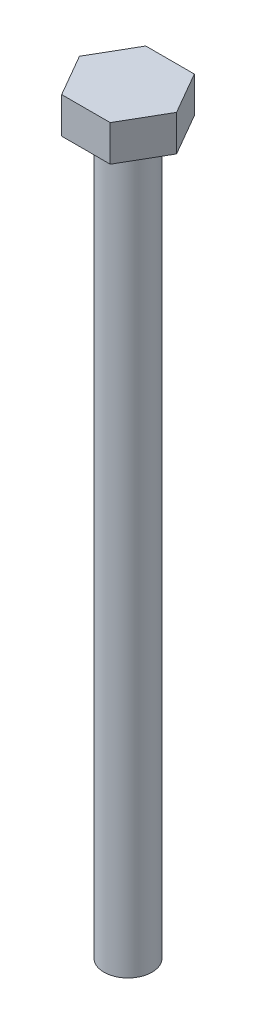
ISO-10303-21;
HEADER;
FILE_DESCRIPTION(('STEP AP214'),'2;1');
FILE_NAME('part.step','',(''),(''),'','','');
FILE_SCHEMA(('AUTOMOTIVE_DESIGN { 1 0 10303 214 1 1 1 1 }'));
ENDSEC;
DATA;
#1=APPLICATION_CONTEXT('core data for automotive mechanical design processes');
#2=APPLICATION_PROTOCOL_DEFINITION('international standard','automotive_design',2000,#1);
#3=PRODUCT_CONTEXT('',#1,'mechanical');
#4=PRODUCT('Part','Part','',(#3));
#5=PRODUCT_RELATED_PRODUCT_CATEGORY('part','',(#4));
#6=PRODUCT_DEFINITION_FORMATION('','',#4);
#7=PRODUCT_DEFINITION_CONTEXT('part definition',#1,'design');
#8=PRODUCT_DEFINITION('design','',#6,#7);
#9=PRODUCT_DEFINITION_SHAPE('','',#8);
#10=(LENGTH_UNIT() NAMED_UNIT(*) SI_UNIT(.MILLI.,.METRE.));
#11=(NAMED_UNIT(*) PLANE_ANGLE_UNIT() SI_UNIT($,.RADIAN.));
#12=(NAMED_UNIT(*) SI_UNIT($,.STERADIAN.) SOLID_ANGLE_UNIT());
#13=UNCERTAINTY_MEASURE_WITH_UNIT(LENGTH_MEASURE(1.E-05),#10,'distance_accuracy_value','');
#14=(GEOMETRIC_REPRESENTATION_CONTEXT(3) GLOBAL_UNCERTAINTY_ASSIGNED_CONTEXT((#13)) GLOBAL_UNIT_ASSIGNED_CONTEXT((#10,
#11,#12)) REPRESENTATION_CONTEXT('',''));
#15=CARTESIAN_POINT('',(0.,0.,0.));
#16=DIRECTION('',(0.,0.,1.));
#17=DIRECTION('',(1.,0.,0.));
#18=AXIS2_PLACEMENT_3D('',#15,#16,#17);
#19=CARTESIAN_POINT('',(0.,60.,0.));
#20=DIRECTION('',(0.,-1.,0.));
#21=DIRECTION('',(0.,0.,-1.));
#22=AXIS2_PLACEMENT_3D('',#19,#20,#21);
#23=CYLINDRICAL_SURFACE('',#22,2.);
#24=CARTESIAN_POINT('',(0.,60.,0.));
#25=DIRECTION('',(0.,1.,0.));
#26=DIRECTION('',(0.,0.,1.));
#27=AXIS2_PLACEMENT_3D('',#24,#25,#26);
#28=CIRCLE('',#27,2.);
#29=CARTESIAN_POINT('',(0.,60.,2.));
#30=VERTEX_POINT('',#29);
#31=EDGE_CURVE('E11',#30,#30,#28,.T.);
#32=ORIENTED_EDGE('',*,*,#31,.F.);
#33=EDGE_LOOP('',(#32));
#34=FACE_BOUND('',#33,.T.);
#35=CARTESIAN_POINT('',(0.,0.,0.));
#36=DIRECTION('',(0.,1.,0.));
#37=DIRECTION('',(0.,0.,1.));
#38=AXIS2_PLACEMENT_3D('',#35,#36,#37);
#39=CIRCLE('',#38,2.);
#40=CARTESIAN_POINT('',(0.,0.,2.));
#41=VERTEX_POINT('',#40);
#42=EDGE_CURVE('E40',#41,#41,#39,.T.);
#43=ORIENTED_EDGE('',*,*,#42,.T.);
#44=EDGE_LOOP('',(#43));
#45=FACE_BOUND('',#44,.T.);
#46=ADVANCED_FACE('F37',(#34,#45),#23,.T.);
#47=CARTESIAN_POINT('',(0.,0.,0.));
#48=DIRECTION('',(0.,1.,0.));
#49=DIRECTION('',(0.,0.,1.));
#50=AXIS2_PLACEMENT_3D('',#47,#48,#49);
#51=PLANE('',#50);
#52=ORIENTED_EDGE('',*,*,#42,.F.);
#53=EDGE_LOOP('',(#52));
#54=FACE_BOUND('',#53,.T.);
#55=ADVANCED_FACE('F145',(#54),#51,.F.);
#56=CARTESIAN_POINT('',(2.02072594216369,63.,3.5));
#57=DIRECTION('',(-0.866025403784439,0.,-0.5));
#58=DIRECTION('',(-0.5,0.,0.866025403784439));
#59=AXIS2_PLACEMENT_3D('',#56,#57,#58);
#60=PLANE('',#59);
#61=DIRECTION('',(0.5,0.,-0.866025403784439));
#62=VECTOR('',#61,1.);
#63=CARTESIAN_POINT('',(2.02072594216369,60.,3.5));
#64=LINE('',#63,#62);
#65=CARTESIAN_POINT('',(2.02072594216369,60.,3.5));
#66=VERTEX_POINT('',#65);
#67=CARTESIAN_POINT('',(4.04145188432738,60.,0.));
#68=VERTEX_POINT('',#67);
#69=EDGE_CURVE('E122',#66,#68,#64,.T.);
#70=ORIENTED_EDGE('',*,*,#69,.T.);
#71=DIRECTION('',(0.,-1.,0.));
#72=VECTOR('',#71,1.);
#73=CARTESIAN_POINT('',(4.04145188432738,63.,0.));
#74=LINE('',#73,#72);
#75=CARTESIAN_POINT('',(4.04145188432738,63.,0.));
#76=VERTEX_POINT('',#75);
#77=EDGE_CURVE('E139',#76,#68,#74,.T.);
#78=ORIENTED_EDGE('',*,*,#77,.F.);
#79=DIRECTION('',(0.5,0.,-0.866025403784439));
#80=VECTOR('',#79,1.);
#81=CARTESIAN_POINT('',(2.02072594216369,63.,3.5));
#82=LINE('',#81,#80);
#83=CARTESIAN_POINT('',(2.02072594216369,63.,3.5));
#84=VERTEX_POINT('',#83);
#85=EDGE_CURVE('E132',#84,#76,#82,.T.);
#86=ORIENTED_EDGE('',*,*,#85,.F.);
#87=DIRECTION('',(0.,-1.,0.));
#88=VECTOR('',#87,1.);
#89=CARTESIAN_POINT('',(2.02072594216369,63.,3.5));
#90=LINE('',#89,#88);
#91=EDGE_CURVE('E118',#84,#66,#90,.T.);
#92=ORIENTED_EDGE('',*,*,#91,.T.);
#93=EDGE_LOOP('',(#70,#78,#86,#92));
#94=FACE_BOUND('',#93,.T.);
#95=ADVANCED_FACE('F147',(#94),#60,.F.);
#96=CARTESIAN_POINT('',(4.04145188432738,63.,0.));
#97=DIRECTION('',(-0.866025403784438,0.,0.5));
#98=DIRECTION('',(0.5,0.,0.866025403784439));
#99=AXIS2_PLACEMENT_3D('',#96,#97,#98);
#100=PLANE('',#99);
#101=DIRECTION('',(-0.5,0.,-0.866025403784439));
#102=VECTOR('',#101,1.);
#103=CARTESIAN_POINT('',(4.04145188432738,60.,0.));
#104=LINE('',#103,#102);
#105=CARTESIAN_POINT('',(2.02072594216369,60.,-3.5));
#106=VERTEX_POINT('',#105);
#107=EDGE_CURVE('E125',#68,#106,#104,.T.);
#108=ORIENTED_EDGE('',*,*,#107,.T.);
#109=DIRECTION('',(0.,-1.,0.));
#110=VECTOR('',#109,1.);
#111=CARTESIAN_POINT('',(2.02072594216369,63.,-3.5));
#112=LINE('',#111,#110);
#113=CARTESIAN_POINT('',(2.02072594216369,63.,-3.5));
#114=VERTEX_POINT('',#113);
#115=EDGE_CURVE('E136',#114,#106,#112,.T.);
#116=ORIENTED_EDGE('',*,*,#115,.F.);
#117=DIRECTION('',(-0.5,0.,-0.866025403784439));
#118=VECTOR('',#117,1.);
#119=CARTESIAN_POINT('',(4.04145188432738,63.,0.));
#120=LINE('',#119,#118);
#121=EDGE_CURVE('E91',#76,#114,#120,.T.);
#122=ORIENTED_EDGE('',*,*,#121,.F.);
#123=ORIENTED_EDGE('',*,*,#77,.T.);
#124=EDGE_LOOP('',(#108,#116,#122,#123));
#125=FACE_BOUND('',#124,.T.);
#126=ADVANCED_FACE('F152',(#125),#100,.F.);
#127=CARTESIAN_POINT('',(2.02072594216369,63.,-3.5));
#128=DIRECTION('',(0.,0.,1.));
#129=DIRECTION('',(1.,0.,0.));
#130=AXIS2_PLACEMENT_3D('',#127,#128,#129);
#131=PLANE('',#130);
#132=DIRECTION('',(-1.,0.,0.));
#133=VECTOR('',#132,1.);
#134=CARTESIAN_POINT('',(2.02072594216369,60.,-3.5));
#135=LINE('',#134,#133);
#136=CARTESIAN_POINT('',(-2.02072594216369,60.,-3.5));
#137=VERTEX_POINT('',#136);
#138=EDGE_CURVE('E127',#106,#137,#135,.T.);
#139=ORIENTED_EDGE('',*,*,#138,.T.);
#140=DIRECTION('',(0.,-1.,0.));
#141=VECTOR('',#140,1.);
#142=CARTESIAN_POINT('',(-2.02072594216369,63.,-3.5));
#143=LINE('',#142,#141);
#144=CARTESIAN_POINT('',(-2.02072594216369,63.,-3.5));
#145=VERTEX_POINT('',#144);
#146=EDGE_CURVE('E113',#145,#137,#143,.T.);
#147=ORIENTED_EDGE('',*,*,#146,.F.);
#148=DIRECTION('',(-1.,0.,0.));
#149=VECTOR('',#148,1.);
#150=CARTESIAN_POINT('',(2.02072594216369,63.,-3.5));
#151=LINE('',#150,#149);
#152=EDGE_CURVE('E104',#114,#145,#151,.T.);
#153=ORIENTED_EDGE('',*,*,#152,.F.);
#154=ORIENTED_EDGE('',*,*,#115,.T.);
#155=EDGE_LOOP('',(#139,#147,#153,#154));
#156=FACE_BOUND('',#155,.T.);
#157=ADVANCED_FACE('F159',(#156),#131,.F.);
#158=CARTESIAN_POINT('',(-2.02072594216369,63.,-3.5));
#159=DIRECTION('',(0.866025403784439,0.,0.5));
#160=DIRECTION('',(0.5,0.,-0.866025403784439));
#161=AXIS2_PLACEMENT_3D('',#158,#159,#160);
#162=PLANE('',#161);
#163=DIRECTION('',(-0.5,0.,0.866025403784439));
#164=VECTOR('',#163,1.);
#165=CARTESIAN_POINT('',(-2.02072594216369,60.,-3.5));
#166=LINE('',#165,#164);
#167=CARTESIAN_POINT('',(-4.04145188432738,60.,0.));
#168=VERTEX_POINT('',#167);
#169=EDGE_CURVE('E112',#137,#168,#166,.T.);
#170=ORIENTED_EDGE('',*,*,#169,.T.);
#171=DIRECTION('',(0.,-1.,0.));
#172=VECTOR('',#171,1.);
#173=CARTESIAN_POINT('',(-4.04145188432738,63.,0.));
#174=LINE('',#173,#172);
#175=CARTESIAN_POINT('',(-4.04145188432738,63.,0.));
#176=VERTEX_POINT('',#175);
#177=EDGE_CURVE('E109',#176,#168,#174,.T.);
#178=ORIENTED_EDGE('',*,*,#177,.F.);
#179=DIRECTION('',(-0.5,0.,0.866025403784439));
#180=VECTOR('',#179,1.);
#181=CARTESIAN_POINT('',(-2.02072594216369,63.,-3.5));
#182=LINE('',#181,#180);
#183=EDGE_CURVE('E98',#145,#176,#182,.T.);
#184=ORIENTED_EDGE('',*,*,#183,.F.);
#185=ORIENTED_EDGE('',*,*,#146,.T.);
#186=EDGE_LOOP('',(#170,#178,#184,#185));
#187=FACE_BOUND('',#186,.T.);
#188=ADVANCED_FACE('F110',(#187),#162,.F.);
#189=CARTESIAN_POINT('',(-4.04145188432738,63.,0.));
#190=DIRECTION('',(0.866025403784439,0.,-0.5));
#191=DIRECTION('',(-0.5,0.,-0.866025403784439));
#192=AXIS2_PLACEMENT_3D('',#189,#190,#191);
#193=PLANE('',#192);
#194=DIRECTION('',(0.5,0.,0.866025403784438));
#195=VECTOR('',#194,1.);
#196=CARTESIAN_POINT('',(-4.04145188432738,60.,0.));
#197=LINE('',#196,#195);
#198=CARTESIAN_POINT('',(-2.02072594216369,60.,3.5));
#199=VERTEX_POINT('',#198);
#200=EDGE_CURVE('E76',#168,#199,#197,.T.);
#201=ORIENTED_EDGE('',*,*,#200,.T.);
#202=DIRECTION('',(0.,-1.,0.));
#203=VECTOR('',#202,1.);
#204=CARTESIAN_POINT('',(-2.02072594216369,63.,3.5));
#205=LINE('',#204,#203);
#206=CARTESIAN_POINT('',(-2.02072594216369,63.,3.5));
#207=VERTEX_POINT('',#206);
#208=EDGE_CURVE('E114',#207,#199,#205,.T.);
#209=ORIENTED_EDGE('',*,*,#208,.F.);
#210=DIRECTION('',(0.5,0.,0.866025403784438));
#211=VECTOR('',#210,1.);
#212=CARTESIAN_POINT('',(-4.04145188432738,63.,0.));
#213=LINE('',#212,#211);
#214=EDGE_CURVE('E102',#176,#207,#213,.T.);
#215=ORIENTED_EDGE('',*,*,#214,.F.);
#216=ORIENTED_EDGE('',*,*,#177,.T.);
#217=EDGE_LOOP('',(#201,#209,#215,#216));
#218=FACE_BOUND('',#217,.T.);
#219=ADVANCED_FACE('F116',(#218),#193,.F.);
#220=CARTESIAN_POINT('',(-2.02072594216369,63.,3.5));
#221=DIRECTION('',(0.,0.,-1.));
#222=DIRECTION('',(-1.,0.,0.));
#223=AXIS2_PLACEMENT_3D('',#220,#221,#222);
#224=PLANE('',#223);
#225=DIRECTION('',(1.,0.,0.));
#226=VECTOR('',#225,1.);
#227=CARTESIAN_POINT('',(-2.02072594216369,60.,3.5));
#228=LINE('',#227,#226);
#229=EDGE_CURVE('E82',#199,#66,#228,.T.);
#230=ORIENTED_EDGE('',*,*,#229,.T.);
#231=ORIENTED_EDGE('',*,*,#91,.F.);
#232=DIRECTION('',(1.,0.,0.));
#233=VECTOR('',#232,1.);
#234=CARTESIAN_POINT('',(-2.02072594216369,63.,3.5));
#235=LINE('',#234,#233);
#236=EDGE_CURVE('E53',#207,#84,#235,.T.);
#237=ORIENTED_EDGE('',*,*,#236,.F.);
#238=ORIENTED_EDGE('',*,*,#208,.T.);
#239=EDGE_LOOP('',(#230,#231,#237,#238));
#240=FACE_BOUND('',#239,.T.);
#241=ADVANCED_FACE('F167',(#240),#224,.F.);
#242=CARTESIAN_POINT('',(0.,63.,0.));
#243=DIRECTION('',(0.,1.,0.));
#244=DIRECTION('',(0.,0.,1.));
#245=AXIS2_PLACEMENT_3D('',#242,#243,#244);
#246=PLANE('',#245);
#247=ORIENTED_EDGE('',*,*,#85,.T.);
#248=ORIENTED_EDGE('',*,*,#121,.T.);
#249=ORIENTED_EDGE('',*,*,#152,.T.);
#250=ORIENTED_EDGE('',*,*,#183,.T.);
#251=ORIENTED_EDGE('',*,*,#214,.T.);
#252=ORIENTED_EDGE('',*,*,#236,.T.);
#253=EDGE_LOOP('',(#247,#248,#249,#250,#251,#252));
#254=FACE_BOUND('',#253,.T.);
#255=ADVANCED_FACE('F100',(#254),#246,.T.);
#256=CARTESIAN_POINT('',(0.,60.,0.));
#257=DIRECTION('',(0.,1.,0.));
#258=DIRECTION('',(0.,0.,1.));
#259=AXIS2_PLACEMENT_3D('',#256,#257,#258);
#260=PLANE('',#259);
#261=ORIENTED_EDGE('',*,*,#31,.T.);
#262=EDGE_LOOP('',(#261));
#263=FACE_BOUND('',#262,.T.);
#264=ORIENTED_EDGE('',*,*,#69,.F.);
#265=ORIENTED_EDGE('',*,*,#229,.F.);
#266=ORIENTED_EDGE('',*,*,#200,.F.);
#267=ORIENTED_EDGE('',*,*,#169,.F.);
#268=ORIENTED_EDGE('',*,*,#138,.F.);
#269=ORIENTED_EDGE('',*,*,#107,.F.);
#270=EDGE_LOOP('',(#264,#265,#266,#267,#268,#269));
#271=FACE_BOUND('',#270,.T.);
#272=ADVANCED_FACE('F170',(#263,#271),#260,.F.);
#273=CLOSED_SHELL('',(#46,#55,#95,#126,#157,#188,#219,#241,#255,#272));
#274=MANIFOLD_SOLID_BREP('B2',#273);
#275=ADVANCED_BREP_SHAPE_REPRESENTATION('',(#18,#274),#14);
#276=SHAPE_DEFINITION_REPRESENTATION(#9,#275);
ENDSEC;
END-ISO-10303-21;
